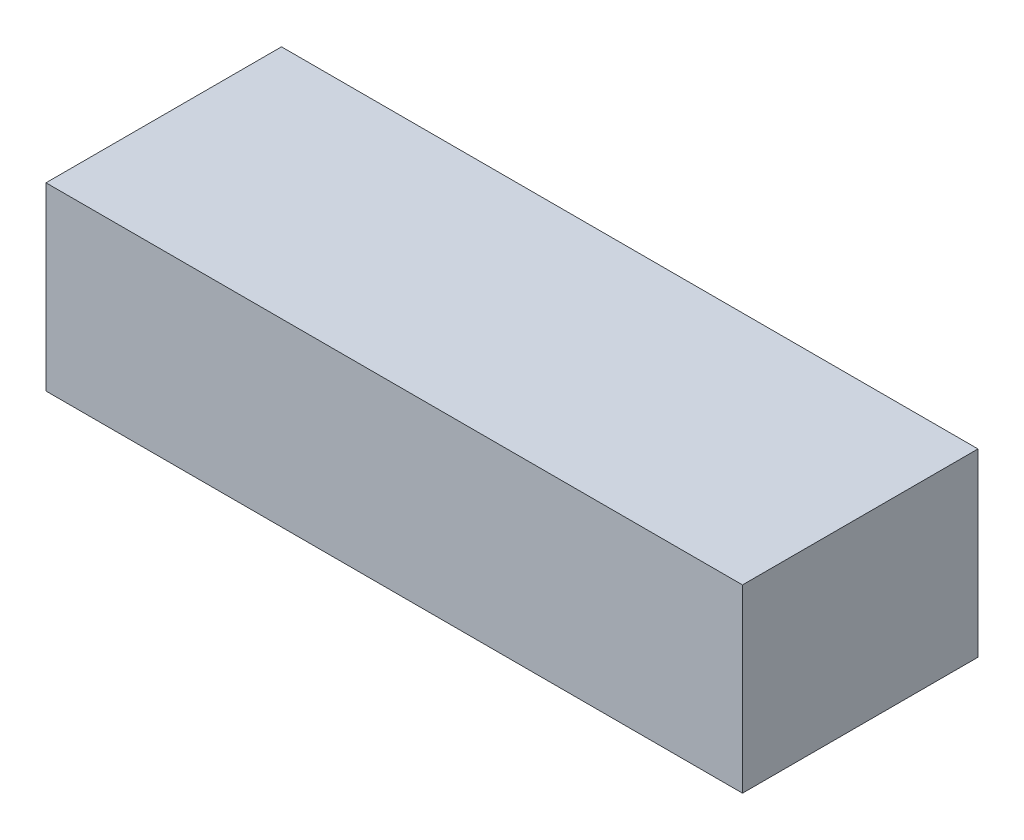
ISO-10303-21;
HEADER;
FILE_DESCRIPTION(('STEP AP214'),'2;1');
FILE_NAME('part.step','',(''),(''),'','','');
FILE_SCHEMA(('AUTOMOTIVE_DESIGN { 1 0 10303 214 1 1 1 1 }'));
ENDSEC;
DATA;
#1=APPLICATION_CONTEXT('core data for automotive mechanical design processes');
#2=APPLICATION_PROTOCOL_DEFINITION('international standard','automotive_design',2000,#1);
#3=PRODUCT_CONTEXT('',#1,'mechanical');
#4=PRODUCT('Part','Part','',(#3));
#5=PRODUCT_RELATED_PRODUCT_CATEGORY('part','',(#4));
#6=PRODUCT_DEFINITION_FORMATION('','',#4);
#7=PRODUCT_DEFINITION_CONTEXT('part definition',#1,'design');
#8=PRODUCT_DEFINITION('design','',#6,#7);
#9=PRODUCT_DEFINITION_SHAPE('','',#8);
#10=(LENGTH_UNIT() NAMED_UNIT(*) SI_UNIT(.MILLI.,.METRE.));
#11=(NAMED_UNIT(*) PLANE_ANGLE_UNIT() SI_UNIT($,.RADIAN.));
#12=(NAMED_UNIT(*) SI_UNIT($,.STERADIAN.) SOLID_ANGLE_UNIT());
#13=UNCERTAINTY_MEASURE_WITH_UNIT(LENGTH_MEASURE(1.E-05),#10,'distance_accuracy_value','');
#14=(GEOMETRIC_REPRESENTATION_CONTEXT(3) GLOBAL_UNCERTAINTY_ASSIGNED_CONTEXT((#13)) GLOBAL_UNIT_ASSIGNED_CONTEXT((#10,
#11,#12)) REPRESENTATION_CONTEXT('',''));
#15=CARTESIAN_POINT('',(0.,0.,0.));
#16=DIRECTION('',(0.,0.,1.));
#17=DIRECTION('',(1.,0.,0.));
#18=AXIS2_PLACEMENT_3D('',#15,#16,#17);
#19=CARTESIAN_POINT('',(69.5,36.,23.5));
#20=DIRECTION('',(-1.,0.,0.));
#21=DIRECTION('',(0.,0.,1.));
#22=AXIS2_PLACEMENT_3D('',#19,#20,#21);
#23=PLANE('',#22);
#24=DIRECTION('',(0.,0.,-1.));
#25=VECTOR('',#24,1.);
#26=CARTESIAN_POINT('',(69.5,0.,23.5));
#27=LINE('',#26,#25);
#28=CARTESIAN_POINT('',(69.5,0.,23.5));
#29=VERTEX_POINT('',#28);
#30=CARTESIAN_POINT('',(69.5,0.,-23.5));
#31=VERTEX_POINT('',#30);
#32=EDGE_CURVE('E162',#29,#31,#27,.T.);
#33=ORIENTED_EDGE('',*,*,#32,.T.);
#34=DIRECTION('',(0.,-1.,0.));
#35=VECTOR('',#34,1.);
#36=CARTESIAN_POINT('',(69.5,36.,-23.5));
#37=LINE('',#36,#35);
#38=CARTESIAN_POINT('',(69.5,36.,-23.5));
#39=VERTEX_POINT('',#38);
#40=EDGE_CURVE('E11',#39,#31,#37,.T.);
#41=ORIENTED_EDGE('',*,*,#40,.F.);
#42=DIRECTION('',(0.,0.,-1.));
#43=VECTOR('',#42,1.);
#44=CARTESIAN_POINT('',(69.5,36.,23.5));
#45=LINE('',#44,#43);
#46=CARTESIAN_POINT('',(69.5,36.,23.5));
#47=VERTEX_POINT('',#46);
#48=EDGE_CURVE('E151',#47,#39,#45,.T.);
#49=ORIENTED_EDGE('',*,*,#48,.F.);
#50=DIRECTION('',(0.,-1.,0.));
#51=VECTOR('',#50,1.);
#52=CARTESIAN_POINT('',(69.5,36.,23.5));
#53=LINE('',#52,#51);
#54=EDGE_CURVE('E161',#47,#29,#53,.T.);
#55=ORIENTED_EDGE('',*,*,#54,.T.);
#56=EDGE_LOOP('',(#33,#41,#49,#55));
#57=FACE_BOUND('',#56,.T.);
#58=ADVANCED_FACE('F45',(#57),#23,.F.);
#59=CARTESIAN_POINT('',(-69.5,36.,-23.5));
#60=DIRECTION('',(0.,0.,1.));
#61=DIRECTION('',(1.,0.,0.));
#62=AXIS2_PLACEMENT_3D('',#59,#60,#61);
#63=PLANE('',#62);
#64=DIRECTION('',(0.,-1.,0.));
#65=VECTOR('',#64,1.);
#66=CARTESIAN_POINT('',(-51.5,23.8902256291846,-23.5));
#67=LINE('',#66,#65);
#68=CARTESIAN_POINT('',(-51.5,23.8902256291846,-23.5));
#69=VERTEX_POINT('',#68);
#70=CARTESIAN_POINT('',(-51.5,11.7759154282712,-23.5));
#71=VERTEX_POINT('',#70);
#72=EDGE_CURVE('E127',#69,#71,#67,.T.);
#73=ORIENTED_EDGE('',*,*,#72,.F.);
#74=DIRECTION('',(-1.,0.,0.));
#75=VECTOR('',#74,1.);
#76=CARTESIAN_POINT('',(-51.5,23.8902256291846,-23.5));
#77=LINE('',#76,#75);
#78=CARTESIAN_POINT('',(-69.5,23.8902256291846,-23.5));
#79=VERTEX_POINT('',#78);
#80=EDGE_CURVE('E167',#69,#79,#77,.T.);
#81=ORIENTED_EDGE('',*,*,#80,.T.);
#82=DIRECTION('',(0.,-1.,0.));
#83=VECTOR('',#82,1.);
#84=CARTESIAN_POINT('',(-69.5,36.,-23.5));
#85=LINE('',#84,#83);
#86=CARTESIAN_POINT('',(-69.5,36.,-23.5));
#87=VERTEX_POINT('',#86);
#88=EDGE_CURVE('E53',#87,#79,#85,.T.);
#89=ORIENTED_EDGE('',*,*,#88,.F.);
#90=DIRECTION('',(-1.,0.,0.));
#91=VECTOR('',#90,1.);
#92=CARTESIAN_POINT('',(-69.5,36.,-23.5));
#93=LINE('',#92,#91);
#94=EDGE_CURVE('E97',#39,#87,#93,.T.);
#95=ORIENTED_EDGE('',*,*,#94,.F.);
#96=ORIENTED_EDGE('',*,*,#40,.T.);
#97=DIRECTION('',(-1.,0.,0.));
#98=VECTOR('',#97,1.);
#99=CARTESIAN_POINT('',(-69.5,0.,-23.5));
#100=LINE('',#99,#98);
#101=CARTESIAN_POINT('',(-69.5,0.,-23.5));
#102=VERTEX_POINT('',#101);
#103=EDGE_CURVE('E166',#31,#102,#100,.T.);
#104=ORIENTED_EDGE('',*,*,#103,.T.);
#105=CARTESIAN_POINT('',(-69.5,11.7759154282712,-23.5));
#106=VERTEX_POINT('',#105);
#107=EDGE_CURVE('E141',#106,#102,#85,.T.);
#108=ORIENTED_EDGE('',*,*,#107,.F.);
#109=DIRECTION('',(-1.,0.,0.));
#110=VECTOR('',#109,1.);
#111=CARTESIAN_POINT('',(-51.5,11.7759154282712,-23.5));
#112=LINE('',#111,#110);
#113=EDGE_CURVE('E60',#71,#106,#112,.T.);
#114=ORIENTED_EDGE('',*,*,#113,.F.);
#115=EDGE_LOOP('',(#73,#81,#89,#95,#96,#104,#108,#114));
#116=FACE_BOUND('',#115,.T.);
#117=ADVANCED_FACE('F139',(#116),#63,.F.);
#118=CARTESIAN_POINT('',(-69.5,36.,23.5));
#119=DIRECTION('',(1.,0.,0.));
#120=DIRECTION('',(0.,0.,-1.));
#121=AXIS2_PLACEMENT_3D('',#118,#119,#120);
#122=PLANE('',#121);
#123=ORIENTED_EDGE('',*,*,#88,.T.);
#124=DIRECTION('',(0.,0.,-1.));
#125=VECTOR('',#124,1.);
#126=CARTESIAN_POINT('',(-69.5,23.8902256291846,-23.5));
#127=LINE('',#126,#125);
#128=CARTESIAN_POINT('',(-69.5,23.8902256291846,-20.0587076090599));
#129=VERTEX_POINT('',#128);
#130=EDGE_CURVE('E136',#129,#79,#127,.T.);
#131=ORIENTED_EDGE('',*,*,#130,.F.);
#132=DIRECTION('',(0.,1.,0.));
#133=VECTOR('',#132,1.);
#134=CARTESIAN_POINT('',(-69.5,23.8902256291846,-20.0587076090599));
#135=LINE('',#134,#133);
#136=CARTESIAN_POINT('',(-69.5,11.7759154282712,-20.0587076090599));
#137=VERTEX_POINT('',#136);
#138=EDGE_CURVE('E205',#137,#129,#135,.T.);
#139=ORIENTED_EDGE('',*,*,#138,.F.);
#140=DIRECTION('',(0.,0.,1.));
#141=VECTOR('',#140,1.);
#142=CARTESIAN_POINT('',(-69.5,11.7759154282712,-23.5));
#143=LINE('',#142,#141);
#144=EDGE_CURVE('E189',#106,#137,#143,.T.);
#145=ORIENTED_EDGE('',*,*,#144,.F.);
#146=ORIENTED_EDGE('',*,*,#107,.T.);
#147=DIRECTION('',(0.,0.,1.));
#148=VECTOR('',#147,1.);
#149=CARTESIAN_POINT('',(-69.5,0.,23.5));
#150=LINE('',#149,#148);
#151=CARTESIAN_POINT('',(-69.5,0.,23.5));
#152=VERTEX_POINT('',#151);
#153=EDGE_CURVE('E170',#102,#152,#150,.T.);
#154=ORIENTED_EDGE('',*,*,#153,.T.);
#155=DIRECTION('',(0.,-1.,0.));
#156=VECTOR('',#155,1.);
#157=CARTESIAN_POINT('',(-69.5,36.,23.5));
#158=LINE('',#157,#156);
#159=CARTESIAN_POINT('',(-69.5,36.,23.5));
#160=VERTEX_POINT('',#159);
#161=EDGE_CURVE('E177',#160,#152,#158,.T.);
#162=ORIENTED_EDGE('',*,*,#161,.F.);
#163=DIRECTION('',(0.,0.,1.));
#164=VECTOR('',#163,1.);
#165=CARTESIAN_POINT('',(-69.5,36.,23.5));
#166=LINE('',#165,#164);
#167=EDGE_CURVE('E156',#87,#160,#166,.T.);
#168=ORIENTED_EDGE('',*,*,#167,.F.);
#169=EDGE_LOOP('',(#123,#131,#139,#145,#146,#154,#162,#168));
#170=FACE_BOUND('',#169,.T.);
#171=ADVANCED_FACE('F185',(#170),#122,.F.);
#172=CARTESIAN_POINT('',(-69.5,36.,23.5));
#173=DIRECTION('',(0.,0.,-1.));
#174=DIRECTION('',(-1.,0.,0.));
#175=AXIS2_PLACEMENT_3D('',#172,#173,#174);
#176=PLANE('',#175);
#177=DIRECTION('',(1.,0.,0.));
#178=VECTOR('',#177,1.);
#179=CARTESIAN_POINT('',(-69.5,0.,23.5));
#180=LINE('',#179,#178);
#181=EDGE_CURVE('E90',#152,#29,#180,.T.);
#182=ORIENTED_EDGE('',*,*,#181,.T.);
#183=ORIENTED_EDGE('',*,*,#54,.F.);
#184=DIRECTION('',(1.,0.,0.));
#185=VECTOR('',#184,1.);
#186=CARTESIAN_POINT('',(-69.5,36.,23.5));
#187=LINE('',#186,#185);
#188=EDGE_CURVE('E69',#160,#47,#187,.T.);
#189=ORIENTED_EDGE('',*,*,#188,.F.);
#190=ORIENTED_EDGE('',*,*,#161,.T.);
#191=EDGE_LOOP('',(#182,#183,#189,#190));
#192=FACE_BOUND('',#191,.T.);
#193=ADVANCED_FACE('F196',(#192),#176,.F.);
#194=CARTESIAN_POINT('',(0.,36.,0.));
#195=DIRECTION('',(0.,-1.,0.));
#196=DIRECTION('',(0.,0.,-1.));
#197=AXIS2_PLACEMENT_3D('',#194,#195,#196);
#198=PLANE('',#197);
#199=ORIENTED_EDGE('',*,*,#48,.T.);
#200=ORIENTED_EDGE('',*,*,#94,.T.);
#201=ORIENTED_EDGE('',*,*,#167,.T.);
#202=ORIENTED_EDGE('',*,*,#188,.T.);
#203=EDGE_LOOP('',(#199,#200,#201,#202));
#204=FACE_BOUND('',#203,.T.);
#205=ADVANCED_FACE('F197',(#204),#198,.F.);
#206=CARTESIAN_POINT('',(0.,0.,0.));
#207=DIRECTION('',(0.,-1.,0.));
#208=DIRECTION('',(0.,0.,-1.));
#209=AXIS2_PLACEMENT_3D('',#206,#207,#208);
#210=PLANE('',#209);
#211=ORIENTED_EDGE('',*,*,#32,.F.);
#212=ORIENTED_EDGE('',*,*,#181,.F.);
#213=ORIENTED_EDGE('',*,*,#153,.F.);
#214=ORIENTED_EDGE('',*,*,#103,.F.);
#215=EDGE_LOOP('',(#211,#212,#213,#214));
#216=FACE_BOUND('',#215,.T.);
#217=ADVANCED_FACE('F193',(#216),#210,.T.);
#218=CARTESIAN_POINT('',(-51.5,23.8902256291846,-23.5));
#219=DIRECTION('',(0.,1.,0.));
#220=DIRECTION('',(0.,0.,1.));
#221=AXIS2_PLACEMENT_3D('',#218,#219,#220);
#222=PLANE('',#221);
#223=ORIENTED_EDGE('',*,*,#130,.T.);
#224=ORIENTED_EDGE('',*,*,#80,.F.);
#225=DIRECTION('',(0.,0.,-1.));
#226=VECTOR('',#225,1.);
#227=CARTESIAN_POINT('',(-51.5,23.8902256291846,-23.5));
#228=LINE('',#227,#226);
#229=CARTESIAN_POINT('',(-51.5,23.8902256291846,-20.0587076090599));
#230=VERTEX_POINT('',#229);
#231=EDGE_CURVE('E133',#230,#69,#228,.T.);
#232=ORIENTED_EDGE('',*,*,#231,.F.);
#233=DIRECTION('',(-1.,0.,0.));
#234=VECTOR('',#233,1.);
#235=CARTESIAN_POINT('',(-51.5,23.8902256291846,-20.0587076090599));
#236=LINE('',#235,#234);
#237=EDGE_CURVE('E146',#230,#129,#236,.T.);
#238=ORIENTED_EDGE('',*,*,#237,.T.);
#239=EDGE_LOOP('',(#223,#224,#232,#238));
#240=FACE_BOUND('',#239,.T.);
#241=ADVANCED_FACE('F213',(#240),#222,.F.);
#242=CARTESIAN_POINT('',(-51.5,23.8902256291846,-20.0587076090599));
#243=DIRECTION('',(0.,0.,1.));
#244=DIRECTION('',(1.,0.,0.));
#245=AXIS2_PLACEMENT_3D('',#242,#243,#244);
#246=PLANE('',#245);
#247=ORIENTED_EDGE('',*,*,#138,.T.);
#248=ORIENTED_EDGE('',*,*,#237,.F.);
#249=DIRECTION('',(0.,1.,0.));
#250=VECTOR('',#249,1.);
#251=CARTESIAN_POINT('',(-51.5,23.8902256291846,-20.0587076090599));
#252=LINE('',#251,#250);
#253=CARTESIAN_POINT('',(-51.5,11.7759154282712,-20.0587076090599));
#254=VERTEX_POINT('',#253);
#255=EDGE_CURVE('E126',#254,#230,#252,.T.);
#256=ORIENTED_EDGE('',*,*,#255,.F.);
#257=DIRECTION('',(-1.,0.,0.));
#258=VECTOR('',#257,1.);
#259=CARTESIAN_POINT('',(-51.5,11.7759154282712,-20.0587076090599));
#260=LINE('',#259,#258);
#261=EDGE_CURVE('E121',#254,#137,#260,.T.);
#262=ORIENTED_EDGE('',*,*,#261,.T.);
#263=EDGE_LOOP('',(#247,#248,#256,#262));
#264=FACE_BOUND('',#263,.T.);
#265=ADVANCED_FACE('F214',(#264),#246,.F.);
#266=CARTESIAN_POINT('',(-51.5,11.7759154282712,-23.5));
#267=DIRECTION('',(0.,-1.,0.));
#268=DIRECTION('',(0.,0.,-1.));
#269=AXIS2_PLACEMENT_3D('',#266,#267,#268);
#270=PLANE('',#269);
#271=ORIENTED_EDGE('',*,*,#144,.T.);
#272=ORIENTED_EDGE('',*,*,#261,.F.);
#273=DIRECTION('',(0.,0.,1.));
#274=VECTOR('',#273,1.);
#275=CARTESIAN_POINT('',(-51.5,11.7759154282712,-23.5));
#276=LINE('',#275,#274);
#277=EDGE_CURVE('E118',#71,#254,#276,.T.);
#278=ORIENTED_EDGE('',*,*,#277,.F.);
#279=ORIENTED_EDGE('',*,*,#113,.T.);
#280=EDGE_LOOP('',(#271,#272,#278,#279));
#281=FACE_BOUND('',#280,.T.);
#282=ADVANCED_FACE('F120',(#281),#270,.F.);
#283=CARTESIAN_POINT('',(-51.5,0.,0.));
#284=DIRECTION('',(-1.,0.,0.));
#285=DIRECTION('',(0.,0.,1.));
#286=AXIS2_PLACEMENT_3D('',#283,#284,#285);
#287=PLANE('',#286);
#288=ORIENTED_EDGE('',*,*,#72,.T.);
#289=ORIENTED_EDGE('',*,*,#277,.T.);
#290=ORIENTED_EDGE('',*,*,#255,.T.);
#291=ORIENTED_EDGE('',*,*,#231,.T.);
#292=EDGE_LOOP('',(#288,#289,#290,#291));
#293=FACE_BOUND('',#292,.T.);
#294=ADVANCED_FACE('F131',(#293),#287,.T.);
#295=CLOSED_SHELL('',(#58,#117,#171,#193,#205,#217,#241,#265,#282,#294));
#296=MANIFOLD_SOLID_BREP('B2',#295);
#297=ADVANCED_BREP_SHAPE_REPRESENTATION('',(#18,#296),#14);
#298=SHAPE_DEFINITION_REPRESENTATION(#9,#297);
ENDSEC;
END-ISO-10303-21;
